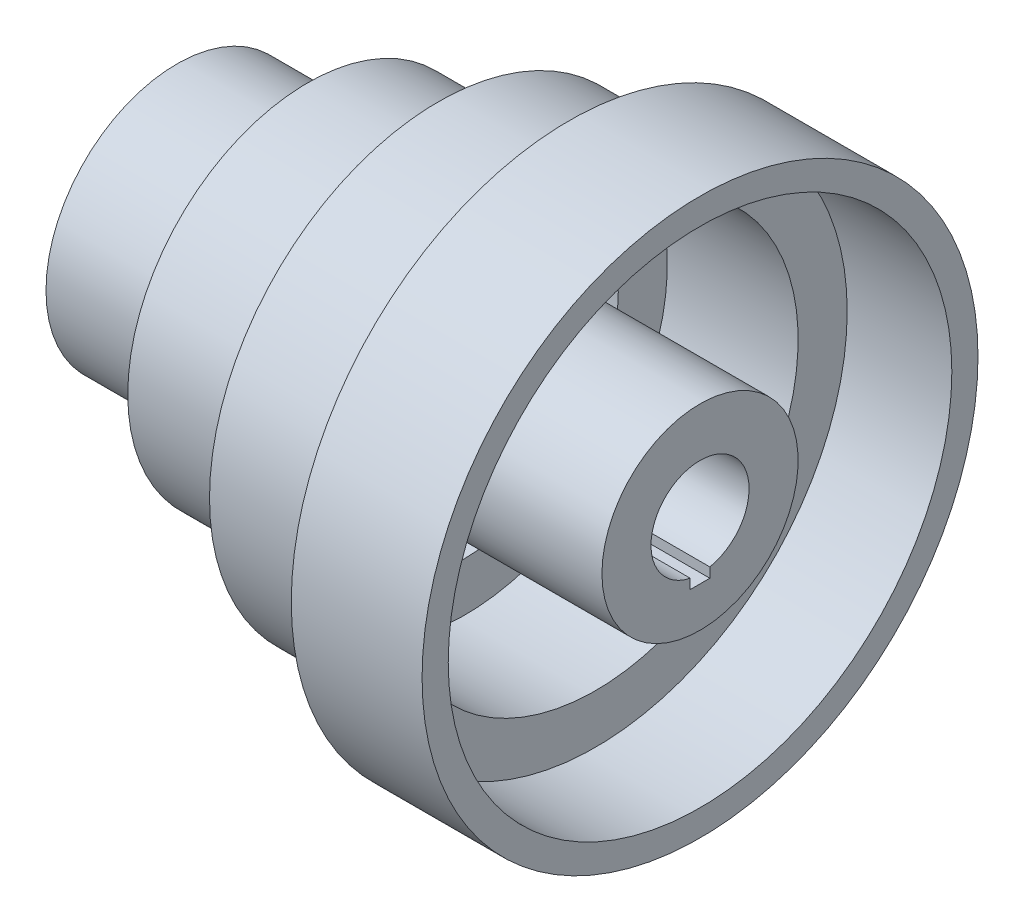
ISO-10303-21;
HEADER;
FILE_DESCRIPTION(('STEP AP214'),'2;1');
FILE_NAME('part.step','',(''),(''),'','','');
FILE_SCHEMA(('AUTOMOTIVE_DESIGN { 1 0 10303 214 1 1 1 1 }'));
ENDSEC;
DATA;
#1=APPLICATION_CONTEXT('core data for automotive mechanical design processes');
#2=APPLICATION_PROTOCOL_DEFINITION('international standard','automotive_design',2000,#1);
#3=PRODUCT_CONTEXT('',#1,'mechanical');
#4=PRODUCT('Part','Part','',(#3));
#5=PRODUCT_RELATED_PRODUCT_CATEGORY('part','',(#4));
#6=PRODUCT_DEFINITION_FORMATION('','',#4);
#7=PRODUCT_DEFINITION_CONTEXT('part definition',#1,'design');
#8=PRODUCT_DEFINITION('design','',#6,#7);
#9=PRODUCT_DEFINITION_SHAPE('','',#8);
#10=(LENGTH_UNIT() NAMED_UNIT(*) SI_UNIT(.MILLI.,.METRE.));
#11=(NAMED_UNIT(*) PLANE_ANGLE_UNIT() SI_UNIT($,.RADIAN.));
#12=(NAMED_UNIT(*) SI_UNIT($,.STERADIAN.) SOLID_ANGLE_UNIT());
#13=UNCERTAINTY_MEASURE_WITH_UNIT(LENGTH_MEASURE(1.E-05),#10,'distance_accuracy_value','');
#14=(GEOMETRIC_REPRESENTATION_CONTEXT(3) GLOBAL_UNCERTAINTY_ASSIGNED_CONTEXT((#13)) GLOBAL_UNIT_ASSIGNED_CONTEXT((#10,
#11,#12)) REPRESENTATION_CONTEXT('',''));
#15=CARTESIAN_POINT('',(0.,0.,0.));
#16=DIRECTION('',(0.,0.,1.));
#17=DIRECTION('',(1.,0.,0.));
#18=AXIS2_PLACEMENT_3D('',#15,#16,#17);
#19=CARTESIAN_POINT('',(-116.687976721956,0.,0.));
#20=DIRECTION('',(-1.,0.,0.));
#21=DIRECTION('',(0.,0.,1.));
#22=AXIS2_PLACEMENT_3D('',#19,#20,#21);
#23=CYLINDRICAL_SURFACE('',#22,40.);
#24=CARTESIAN_POINT('',(0.,0.,0.));
#25=DIRECTION('',(-1.,0.,0.));
#26=DIRECTION('',(0.,0.,1.));
#27=AXIS2_PLACEMENT_3D('',#24,#25,#26);
#28=CIRCLE('',#27,40.);
#29=CARTESIAN_POINT('',(0.,0.,40.));
#30=VERTEX_POINT('',#29);
#31=EDGE_CURVE('E11',#30,#30,#28,.T.);
#32=ORIENTED_EDGE('',*,*,#31,.F.);
#33=EDGE_LOOP('',(#32));
#34=FACE_BOUND('',#33,.T.);
#35=CARTESIAN_POINT('',(40.,0.,0.));
#36=DIRECTION('',(-1.,0.,0.));
#37=DIRECTION('',(0.,0.,1.));
#38=AXIS2_PLACEMENT_3D('',#35,#36,#37);
#39=CIRCLE('',#38,40.);
#40=CARTESIAN_POINT('',(40.,0.,40.));
#41=VERTEX_POINT('',#40);
#42=EDGE_CURVE('E86',#41,#41,#39,.T.);
#43=ORIENTED_EDGE('',*,*,#42,.T.);
#44=EDGE_LOOP('',(#43));
#45=FACE_BOUND('',#44,.T.);
#46=ADVANCED_FACE('F37',(#34,#45),#23,.T.);
#47=CARTESIAN_POINT('',(0.,0.,-15.));
#48=DIRECTION('',(1.,0.,0.));
#49=DIRECTION('',(0.,0.,-1.));
#50=AXIS2_PLACEMENT_3D('',#47,#48,#49);
#51=PLANE('',#50);
#52=CARTESIAN_POINT('',(0.,0.,0.));
#53=DIRECTION('',(-1.,0.,0.));
#54=DIRECTION('',(0.,0.,1.));
#55=AXIS2_PLACEMENT_3D('',#52,#53,#54);
#56=CIRCLE('',#55,15.);
#57=CARTESIAN_POINT('',(0.,-14.6969384566991,3.));
#58=VERTEX_POINT('',#57);
#59=CARTESIAN_POINT('',(0.,-14.6969384566991,-3.));
#60=VERTEX_POINT('',#59);
#61=EDGE_CURVE('E44',#58,#60,#56,.T.);
#62=ORIENTED_EDGE('',*,*,#61,.F.);
#63=DIRECTION('',(0.,1.,0.));
#64=VECTOR('',#63,1.);
#65=CARTESIAN_POINT('',(0.,-17.6969384566991,3.));
#66=LINE('',#65,#64);
#67=CARTESIAN_POINT('',(0.,-17.6969384566991,3.));
#68=VERTEX_POINT('',#67);
#69=EDGE_CURVE('E94',#68,#58,#66,.T.);
#70=ORIENTED_EDGE('',*,*,#69,.F.);
#71=DIRECTION('',(0.,0.,1.));
#72=VECTOR('',#71,1.);
#73=CARTESIAN_POINT('',(0.,-17.6969384566991,-3.));
#74=LINE('',#73,#72);
#75=CARTESIAN_POINT('',(0.,-17.6969384566991,-3.));
#76=VERTEX_POINT('',#75);
#77=EDGE_CURVE('E149',#76,#68,#74,.T.);
#78=ORIENTED_EDGE('',*,*,#77,.F.);
#79=DIRECTION('',(0.,-1.,0.));
#80=VECTOR('',#79,1.);
#81=CARTESIAN_POINT('',(0.,-14.6969384566991,-3.));
#82=LINE('',#81,#80);
#83=EDGE_CURVE('E152',#60,#76,#82,.T.);
#84=ORIENTED_EDGE('',*,*,#83,.F.);
#85=EDGE_LOOP('',(#62,#70,#78,#84));
#86=FACE_BOUND('',#85,.T.);
#87=ORIENTED_EDGE('',*,*,#31,.T.);
#88=EDGE_LOOP('',(#87));
#89=FACE_BOUND('',#88,.T.);
#90=ADVANCED_FACE('F160',(#86,#89),#51,.F.);
#91=CARTESIAN_POINT('',(-116.687976721956,0.,0.));
#92=DIRECTION('',(-1.,0.,0.));
#93=DIRECTION('',(0.,0.,1.));
#94=AXIS2_PLACEMENT_3D('',#91,#92,#93);
#95=CYLINDRICAL_SURFACE('',#94,15.);
#96=CARTESIAN_POINT('',(160.,0.,0.));
#97=DIRECTION('',(-1.,0.,0.));
#98=DIRECTION('',(0.,0.,1.));
#99=AXIS2_PLACEMENT_3D('',#96,#97,#98);
#100=CIRCLE('',#99,15.);
#101=CARTESIAN_POINT('',(160.,-14.6969384566991,3.));
#102=VERTEX_POINT('',#101);
#103=CARTESIAN_POINT('',(160.,-14.6969384566991,-3.));
#104=VERTEX_POINT('',#103);
#105=EDGE_CURVE('E92',#102,#104,#100,.T.);
#106=ORIENTED_EDGE('',*,*,#105,.F.);
#107=DIRECTION('',(-1.,0.,0.));
#108=VECTOR('',#107,1.);
#109=CARTESIAN_POINT('',(160.001,-14.6969384566991,3.));
#110=LINE('',#109,#108);
#111=EDGE_CURVE('E59',#102,#58,#110,.T.);
#112=ORIENTED_EDGE('',*,*,#111,.T.);
#113=ORIENTED_EDGE('',*,*,#61,.T.);
#114=DIRECTION('',(-1.,0.,0.));
#115=VECTOR('',#114,1.);
#116=CARTESIAN_POINT('',(160.001,-14.6969384566991,-3.));
#117=LINE('',#116,#115);
#118=EDGE_CURVE('E81',#104,#60,#117,.T.);
#119=ORIENTED_EDGE('',*,*,#118,.F.);
#120=EDGE_LOOP('',(#106,#112,#113,#119));
#121=FACE_BOUND('',#120,.T.);
#122=ADVANCED_FACE('F91',(#121),#95,.F.);
#123=CARTESIAN_POINT('',(160.,0.,-30.));
#124=DIRECTION('',(-1.,0.,0.));
#125=DIRECTION('',(0.,0.,1.));
#126=AXIS2_PLACEMENT_3D('',#123,#124,#125);
#127=PLANE('',#126);
#128=CARTESIAN_POINT('',(160.,0.,0.));
#129=DIRECTION('',(-1.,0.,0.));
#130=DIRECTION('',(0.,0.,1.));
#131=AXIS2_PLACEMENT_3D('',#128,#129,#130);
#132=CIRCLE('',#131,30.);
#133=CARTESIAN_POINT('',(160.,0.,30.));
#134=VERTEX_POINT('',#133);
#135=EDGE_CURVE('E98',#134,#134,#132,.T.);
#136=ORIENTED_EDGE('',*,*,#135,.F.);
#137=EDGE_LOOP('',(#136));
#138=FACE_BOUND('',#137,.T.);
#139=DIRECTION('',(0.,0.,-1.));
#140=VECTOR('',#139,1.);
#141=CARTESIAN_POINT('',(160.,-17.6969384566991,-3.));
#142=LINE('',#141,#140);
#143=CARTESIAN_POINT('',(160.,-17.6969384566991,3.));
#144=VERTEX_POINT('',#143);
#145=CARTESIAN_POINT('',(160.,-17.6969384566991,-3.));
#146=VERTEX_POINT('',#145);
#147=EDGE_CURVE('E51',#144,#146,#142,.T.);
#148=ORIENTED_EDGE('',*,*,#147,.F.);
#149=DIRECTION('',(0.,-1.,0.));
#150=VECTOR('',#149,1.);
#151=CARTESIAN_POINT('',(160.,-17.6969384566991,3.));
#152=LINE('',#151,#150);
#153=EDGE_CURVE('E97',#102,#144,#152,.T.);
#154=ORIENTED_EDGE('',*,*,#153,.F.);
#155=ORIENTED_EDGE('',*,*,#105,.T.);
#156=DIRECTION('',(0.,1.,0.));
#157=VECTOR('',#156,1.);
#158=CARTESIAN_POINT('',(160.,-14.6969384566991,-3.));
#159=LINE('',#158,#157);
#160=EDGE_CURVE('E77',#146,#104,#159,.T.);
#161=ORIENTED_EDGE('',*,*,#160,.F.);
#162=EDGE_LOOP('',(#148,#154,#155,#161));
#163=FACE_BOUND('',#162,.T.);
#164=ADVANCED_FACE('F96',(#138,#163),#127,.F.);
#165=CARTESIAN_POINT('',(-116.687976721956,0.,0.));
#166=DIRECTION('',(-1.,0.,0.));
#167=DIRECTION('',(0.,0.,1.));
#168=AXIS2_PLACEMENT_3D('',#165,#166,#167);
#169=CYLINDRICAL_SURFACE('',#168,30.);
#170=CARTESIAN_POINT('',(48.,0.,0.));
#171=DIRECTION('',(-1.,0.,0.));
#172=DIRECTION('',(0.,0.,1.));
#173=AXIS2_PLACEMENT_3D('',#170,#171,#172);
#174=CIRCLE('',#173,30.);
#175=CARTESIAN_POINT('',(48.,0.,30.));
#176=VERTEX_POINT('',#175);
#177=EDGE_CURVE('E101',#176,#176,#174,.T.);
#178=ORIENTED_EDGE('',*,*,#177,.F.);
#179=EDGE_LOOP('',(#178));
#180=FACE_BOUND('',#179,.T.);
#181=ORIENTED_EDGE('',*,*,#135,.T.);
#182=EDGE_LOOP('',(#181));
#183=FACE_BOUND('',#182,.T.);
#184=ADVANCED_FACE('F244',(#180,#183),#169,.T.);
#185=CARTESIAN_POINT('',(48.,0.,-47.));
#186=DIRECTION('',(-1.,0.,0.));
#187=DIRECTION('',(0.,0.,1.));
#188=AXIS2_PLACEMENT_3D('',#185,#186,#187);
#189=PLANE('',#188);
#190=CARTESIAN_POINT('',(48.,0.,0.));
#191=DIRECTION('',(-1.,0.,0.));
#192=DIRECTION('',(0.,0.,1.));
#193=AXIS2_PLACEMENT_3D('',#190,#191,#192);
#194=CIRCLE('',#193,47.);
#195=CARTESIAN_POINT('',(48.,0.,47.));
#196=VERTEX_POINT('',#195);
#197=EDGE_CURVE('E106',#196,#196,#194,.T.);
#198=ORIENTED_EDGE('',*,*,#197,.F.);
#199=EDGE_LOOP('',(#198));
#200=FACE_BOUND('',#199,.T.);
#201=ORIENTED_EDGE('',*,*,#177,.T.);
#202=EDGE_LOOP('',(#201));
#203=FACE_BOUND('',#202,.T.);
#204=ADVANCED_FACE('F238',(#200,#203),#189,.F.);
#205=CARTESIAN_POINT('',(-116.687976721956,0.,0.));
#206=DIRECTION('',(-1.,0.,0.));
#207=DIRECTION('',(0.,0.,1.));
#208=AXIS2_PLACEMENT_3D('',#205,#206,#207);
#209=CYLINDRICAL_SURFACE('',#208,47.);
#210=CARTESIAN_POINT('',(88.,0.,0.));
#211=DIRECTION('',(-1.,0.,0.));
#212=DIRECTION('',(0.,0.,1.));
#213=AXIS2_PLACEMENT_3D('',#210,#211,#212);
#214=CIRCLE('',#213,47.);
#215=CARTESIAN_POINT('',(88.,0.,47.));
#216=VERTEX_POINT('',#215);
#217=EDGE_CURVE('E109',#216,#216,#214,.T.);
#218=ORIENTED_EDGE('',*,*,#217,.F.);
#219=EDGE_LOOP('',(#218));
#220=FACE_BOUND('',#219,.T.);
#221=ORIENTED_EDGE('',*,*,#197,.T.);
#222=EDGE_LOOP('',(#221));
#223=FACE_BOUND('',#222,.T.);
#224=ADVANCED_FACE('F232',(#220,#223),#209,.F.);
#225=CARTESIAN_POINT('',(88.,0.,-62.));
#226=DIRECTION('',(-1.,0.,0.));
#227=DIRECTION('',(0.,0.,1.));
#228=AXIS2_PLACEMENT_3D('',#225,#226,#227);
#229=PLANE('',#228);
#230=CARTESIAN_POINT('',(88.,0.,0.));
#231=DIRECTION('',(-1.,0.,0.));
#232=DIRECTION('',(0.,0.,1.));
#233=AXIS2_PLACEMENT_3D('',#230,#231,#232);
#234=CIRCLE('',#233,62.);
#235=CARTESIAN_POINT('',(88.,0.,62.));
#236=VERTEX_POINT('',#235);
#237=EDGE_CURVE('E112',#236,#236,#234,.T.);
#238=ORIENTED_EDGE('',*,*,#237,.F.);
#239=EDGE_LOOP('',(#238));
#240=FACE_BOUND('',#239,.T.);
#241=ORIENTED_EDGE('',*,*,#217,.T.);
#242=EDGE_LOOP('',(#241));
#243=FACE_BOUND('',#242,.T.);
#244=ADVANCED_FACE('F226',(#240,#243),#229,.F.);
#245=CARTESIAN_POINT('',(-116.687976721956,0.,0.));
#246=DIRECTION('',(-1.,0.,0.));
#247=DIRECTION('',(0.,0.,1.));
#248=AXIS2_PLACEMENT_3D('',#245,#246,#247);
#249=CYLINDRICAL_SURFACE('',#248,62.);
#250=CARTESIAN_POINT('',(128.,0.,0.));
#251=DIRECTION('',(-1.,0.,0.));
#252=DIRECTION('',(0.,0.,1.));
#253=AXIS2_PLACEMENT_3D('',#250,#251,#252);
#254=CIRCLE('',#253,62.);
#255=CARTESIAN_POINT('',(128.,0.,62.));
#256=VERTEX_POINT('',#255);
#257=EDGE_CURVE('E115',#256,#256,#254,.T.);
#258=ORIENTED_EDGE('',*,*,#257,.F.);
#259=EDGE_LOOP('',(#258));
#260=FACE_BOUND('',#259,.T.);
#261=ORIENTED_EDGE('',*,*,#237,.T.);
#262=EDGE_LOOP('',(#261));
#263=FACE_BOUND('',#262,.T.);
#264=ADVANCED_FACE('F220',(#260,#263),#249,.F.);
#265=CARTESIAN_POINT('',(128.,0.,-77.));
#266=DIRECTION('',(-1.,0.,0.));
#267=DIRECTION('',(0.,0.,1.));
#268=AXIS2_PLACEMENT_3D('',#265,#266,#267);
#269=PLANE('',#268);
#270=CARTESIAN_POINT('',(128.,0.,0.));
#271=DIRECTION('',(-1.,0.,0.));
#272=DIRECTION('',(0.,0.,1.));
#273=AXIS2_PLACEMENT_3D('',#270,#271,#272);
#274=CIRCLE('',#273,77.);
#275=CARTESIAN_POINT('',(128.,0.,77.));
#276=VERTEX_POINT('',#275);
#277=EDGE_CURVE('E118',#276,#276,#274,.T.);
#278=ORIENTED_EDGE('',*,*,#277,.F.);
#279=EDGE_LOOP('',(#278));
#280=FACE_BOUND('',#279,.T.);
#281=ORIENTED_EDGE('',*,*,#257,.T.);
#282=EDGE_LOOP('',(#281));
#283=FACE_BOUND('',#282,.T.);
#284=ADVANCED_FACE('F214',(#280,#283),#269,.F.);
#285=CARTESIAN_POINT('',(-116.687976721956,0.,0.));
#286=DIRECTION('',(-1.,0.,0.));
#287=DIRECTION('',(0.,0.,1.));
#288=AXIS2_PLACEMENT_3D('',#285,#286,#287);
#289=CYLINDRICAL_SURFACE('',#288,77.);
#290=CARTESIAN_POINT('',(160.,0.,0.));
#291=DIRECTION('',(-1.,0.,0.));
#292=DIRECTION('',(0.,0.,1.));
#293=AXIS2_PLACEMENT_3D('',#290,#291,#292);
#294=CIRCLE('',#293,77.);
#295=CARTESIAN_POINT('',(160.,0.,77.));
#296=VERTEX_POINT('',#295);
#297=EDGE_CURVE('E121',#296,#296,#294,.T.);
#298=ORIENTED_EDGE('',*,*,#297,.F.);
#299=EDGE_LOOP('',(#298));
#300=FACE_BOUND('',#299,.T.);
#301=ORIENTED_EDGE('',*,*,#277,.T.);
#302=EDGE_LOOP('',(#301));
#303=FACE_BOUND('',#302,.T.);
#304=ADVANCED_FACE('F208',(#300,#303),#289,.F.);
#305=CARTESIAN_POINT('',(160.,0.,-85.));
#306=DIRECTION('',(-1.,0.,0.));
#307=DIRECTION('',(0.,0.,1.));
#308=AXIS2_PLACEMENT_3D('',#305,#306,#307);
#309=PLANE('',#308);
#310=CARTESIAN_POINT('',(160.,0.,0.));
#311=DIRECTION('',(-1.,0.,0.));
#312=DIRECTION('',(0.,0.,1.));
#313=AXIS2_PLACEMENT_3D('',#310,#311,#312);
#314=CIRCLE('',#313,85.);
#315=CARTESIAN_POINT('',(160.,0.,85.));
#316=VERTEX_POINT('',#315);
#317=EDGE_CURVE('E124',#316,#316,#314,.T.);
#318=ORIENTED_EDGE('',*,*,#317,.F.);
#319=EDGE_LOOP('',(#318));
#320=FACE_BOUND('',#319,.T.);
#321=ORIENTED_EDGE('',*,*,#297,.T.);
#322=EDGE_LOOP('',(#321));
#323=FACE_BOUND('',#322,.T.);
#324=ADVANCED_FACE('F202',(#320,#323),#309,.F.);
#325=CARTESIAN_POINT('',(-116.687976721956,0.,0.));
#326=DIRECTION('',(-1.,0.,0.));
#327=DIRECTION('',(0.,0.,1.));
#328=AXIS2_PLACEMENT_3D('',#325,#326,#327);
#329=CYLINDRICAL_SURFACE('',#328,85.);
#330=CARTESIAN_POINT('',(120.,0.,0.));
#331=DIRECTION('',(-1.,0.,0.));
#332=DIRECTION('',(0.,0.,1.));
#333=AXIS2_PLACEMENT_3D('',#330,#331,#332);
#334=CIRCLE('',#333,85.);
#335=CARTESIAN_POINT('',(120.,0.,85.));
#336=VERTEX_POINT('',#335);
#337=EDGE_CURVE('E127',#336,#336,#334,.T.);
#338=ORIENTED_EDGE('',*,*,#337,.F.);
#339=EDGE_LOOP('',(#338));
#340=FACE_BOUND('',#339,.T.);
#341=ORIENTED_EDGE('',*,*,#317,.T.);
#342=EDGE_LOOP('',(#341));
#343=FACE_BOUND('',#342,.T.);
#344=ADVANCED_FACE('F196',(#340,#343),#329,.T.);
#345=CARTESIAN_POINT('',(120.,0.,-70.));
#346=DIRECTION('',(1.,0.,0.));
#347=DIRECTION('',(0.,0.,-1.));
#348=AXIS2_PLACEMENT_3D('',#345,#346,#347);
#349=PLANE('',#348);
#350=CARTESIAN_POINT('',(120.,0.,0.));
#351=DIRECTION('',(-1.,0.,0.));
#352=DIRECTION('',(0.,0.,1.));
#353=AXIS2_PLACEMENT_3D('',#350,#351,#352);
#354=CIRCLE('',#353,70.);
#355=CARTESIAN_POINT('',(120.,0.,70.));
#356=VERTEX_POINT('',#355);
#357=EDGE_CURVE('E130',#356,#356,#354,.T.);
#358=ORIENTED_EDGE('',*,*,#357,.F.);
#359=EDGE_LOOP('',(#358));
#360=FACE_BOUND('',#359,.T.);
#361=ORIENTED_EDGE('',*,*,#337,.T.);
#362=EDGE_LOOP('',(#361));
#363=FACE_BOUND('',#362,.T.);
#364=ADVANCED_FACE('F190',(#360,#363),#349,.F.);
#365=CARTESIAN_POINT('',(-116.687976721956,0.,0.));
#366=DIRECTION('',(-1.,0.,0.));
#367=DIRECTION('',(0.,0.,1.));
#368=AXIS2_PLACEMENT_3D('',#365,#366,#367);
#369=CYLINDRICAL_SURFACE('',#368,70.);
#370=CARTESIAN_POINT('',(80.,0.,0.));
#371=DIRECTION('',(-1.,0.,0.));
#372=DIRECTION('',(0.,0.,1.));
#373=AXIS2_PLACEMENT_3D('',#370,#371,#372);
#374=CIRCLE('',#373,70.);
#375=CARTESIAN_POINT('',(80.,0.,70.));
#376=VERTEX_POINT('',#375);
#377=EDGE_CURVE('E133',#376,#376,#374,.T.);
#378=ORIENTED_EDGE('',*,*,#377,.F.);
#379=EDGE_LOOP('',(#378));
#380=FACE_BOUND('',#379,.T.);
#381=ORIENTED_EDGE('',*,*,#357,.T.);
#382=EDGE_LOOP('',(#381));
#383=FACE_BOUND('',#382,.T.);
#384=ADVANCED_FACE('F184',(#380,#383),#369,.T.);
#385=CARTESIAN_POINT('',(80.,0.,-55.));
#386=DIRECTION('',(1.,0.,0.));
#387=DIRECTION('',(0.,0.,-1.));
#388=AXIS2_PLACEMENT_3D('',#385,#386,#387);
#389=PLANE('',#388);
#390=CARTESIAN_POINT('',(80.,0.,0.));
#391=DIRECTION('',(-1.,0.,0.));
#392=DIRECTION('',(0.,0.,1.));
#393=AXIS2_PLACEMENT_3D('',#390,#391,#392);
#394=CIRCLE('',#393,55.);
#395=CARTESIAN_POINT('',(80.,0.,55.));
#396=VERTEX_POINT('',#395);
#397=EDGE_CURVE('E136',#396,#396,#394,.T.);
#398=ORIENTED_EDGE('',*,*,#397,.F.);
#399=EDGE_LOOP('',(#398));
#400=FACE_BOUND('',#399,.T.);
#401=ORIENTED_EDGE('',*,*,#377,.T.);
#402=EDGE_LOOP('',(#401));
#403=FACE_BOUND('',#402,.T.);
#404=ADVANCED_FACE('F178',(#400,#403),#389,.F.);
#405=CARTESIAN_POINT('',(-116.687976721956,0.,0.));
#406=DIRECTION('',(-1.,0.,0.));
#407=DIRECTION('',(0.,0.,1.));
#408=AXIS2_PLACEMENT_3D('',#405,#406,#407);
#409=CYLINDRICAL_SURFACE('',#408,55.);
#410=CARTESIAN_POINT('',(40.,0.,0.));
#411=DIRECTION('',(-1.,0.,0.));
#412=DIRECTION('',(0.,0.,1.));
#413=AXIS2_PLACEMENT_3D('',#410,#411,#412);
#414=CIRCLE('',#413,55.);
#415=CARTESIAN_POINT('',(40.,0.,55.));
#416=VERTEX_POINT('',#415);
#417=EDGE_CURVE('E139',#416,#416,#414,.T.);
#418=ORIENTED_EDGE('',*,*,#417,.F.);
#419=EDGE_LOOP('',(#418));
#420=FACE_BOUND('',#419,.T.);
#421=ORIENTED_EDGE('',*,*,#397,.T.);
#422=EDGE_LOOP('',(#421));
#423=FACE_BOUND('',#422,.T.);
#424=ADVANCED_FACE('F172',(#420,#423),#409,.T.);
#425=CARTESIAN_POINT('',(40.,0.,-40.));
#426=DIRECTION('',(1.,0.,0.));
#427=DIRECTION('',(0.,0.,-1.));
#428=AXIS2_PLACEMENT_3D('',#425,#426,#427);
#429=PLANE('',#428);
#430=ORIENTED_EDGE('',*,*,#42,.F.);
#431=EDGE_LOOP('',(#430));
#432=FACE_BOUND('',#431,.T.);
#433=ORIENTED_EDGE('',*,*,#417,.T.);
#434=EDGE_LOOP('',(#433));
#435=FACE_BOUND('',#434,.T.);
#436=ADVANCED_FACE('F169',(#432,#435),#429,.F.);
#437=CARTESIAN_POINT('',(160.001,-17.6969384566991,3.));
#438=DIRECTION('',(0.,0.,1.));
#439=DIRECTION('',(0.,-1.,0.));
#440=AXIS2_PLACEMENT_3D('',#437,#438,#439);
#441=PLANE('',#440);
#442=ORIENTED_EDGE('',*,*,#153,.T.);
#443=DIRECTION('',(-1.,0.,0.));
#444=VECTOR('',#443,1.);
#445=CARTESIAN_POINT('',(160.001,-17.6969384566991,3.));
#446=LINE('',#445,#444);
#447=EDGE_CURVE('E145',#144,#68,#446,.T.);
#448=ORIENTED_EDGE('',*,*,#447,.T.);
#449=ORIENTED_EDGE('',*,*,#69,.T.);
#450=ORIENTED_EDGE('',*,*,#111,.F.);
#451=EDGE_LOOP('',(#442,#448,#449,#450));
#452=FACE_BOUND('',#451,.T.);
#453=ADVANCED_FACE('F155',(#452),#441,.F.);
#454=CARTESIAN_POINT('',(160.001,-17.6969384566991,-3.));
#455=DIRECTION('',(0.,-1.,0.));
#456=DIRECTION('',(0.,0.,-1.));
#457=AXIS2_PLACEMENT_3D('',#454,#455,#456);
#458=PLANE('',#457);
#459=ORIENTED_EDGE('',*,*,#147,.T.);
#460=DIRECTION('',(-1.,0.,0.));
#461=VECTOR('',#460,1.);
#462=CARTESIAN_POINT('',(160.001,-17.6969384566991,-3.));
#463=LINE('',#462,#461);
#464=EDGE_CURVE('E83',#146,#76,#463,.T.);
#465=ORIENTED_EDGE('',*,*,#464,.T.);
#466=ORIENTED_EDGE('',*,*,#77,.T.);
#467=ORIENTED_EDGE('',*,*,#447,.F.);
#468=EDGE_LOOP('',(#459,#465,#466,#467));
#469=FACE_BOUND('',#468,.T.);
#470=ADVANCED_FACE('F158',(#469),#458,.F.);
#471=CARTESIAN_POINT('',(160.001,-14.6969384566991,-3.));
#472=DIRECTION('',(0.,0.,-1.));
#473=DIRECTION('',(0.,1.,0.));
#474=AXIS2_PLACEMENT_3D('',#471,#472,#473);
#475=PLANE('',#474);
#476=ORIENTED_EDGE('',*,*,#160,.T.);
#477=ORIENTED_EDGE('',*,*,#118,.T.);
#478=ORIENTED_EDGE('',*,*,#83,.T.);
#479=ORIENTED_EDGE('',*,*,#464,.F.);
#480=EDGE_LOOP('',(#476,#477,#478,#479));
#481=FACE_BOUND('',#480,.T.);
#482=ADVANCED_FACE('F79',(#481),#475,.F.);
#483=CLOSED_SHELL('',(#46,#90,#122,#164,#184,#204,#224,#244,#264,#284,#304,#324,#344,#364,#384,
#404,#424,#436,#453,#470,#482));
#484=MANIFOLD_SOLID_BREP('B2',#483);
#485=ADVANCED_BREP_SHAPE_REPRESENTATION('',(#18,#484),#14);
#486=SHAPE_DEFINITION_REPRESENTATION(#9,#485);
ENDSEC;
END-ISO-10303-21;
